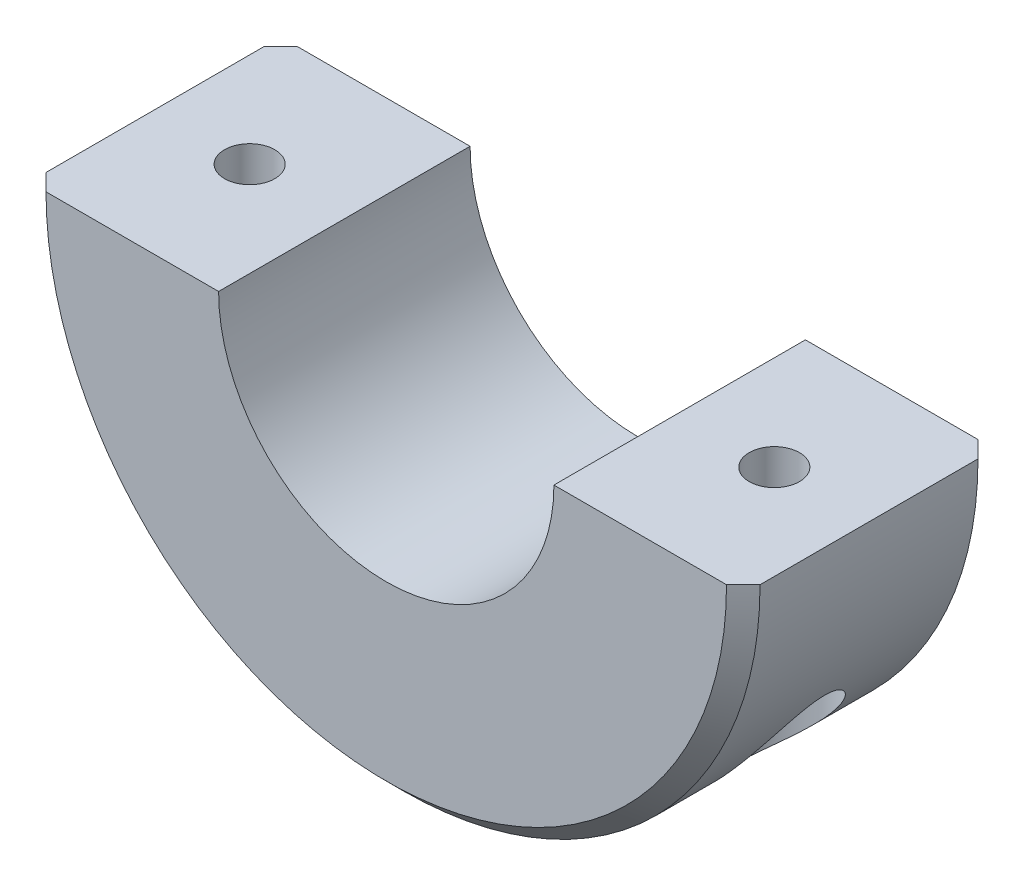
ISO-10303-21;
HEADER;
FILE_DESCRIPTION(('STEP AP214'),'2;1');
FILE_NAME('part.step','',(''),(''),'','','');
FILE_SCHEMA(('AUTOMOTIVE_DESIGN { 1 0 10303 214 1 1 1 1 }'));
ENDSEC;
DATA;
#1=APPLICATION_CONTEXT('core data for automotive mechanical design processes');
#2=APPLICATION_PROTOCOL_DEFINITION('international standard','automotive_design',2000,#1);
#3=PRODUCT_CONTEXT('',#1,'mechanical');
#4=PRODUCT('Part','Part','',(#3));
#5=PRODUCT_RELATED_PRODUCT_CATEGORY('part','',(#4));
#6=PRODUCT_DEFINITION_FORMATION('','',#4);
#7=PRODUCT_DEFINITION_CONTEXT('part definition',#1,'design');
#8=PRODUCT_DEFINITION('design','',#6,#7);
#9=PRODUCT_DEFINITION_SHAPE('','',#8);
#10=(LENGTH_UNIT() NAMED_UNIT(*) SI_UNIT(.MILLI.,.METRE.));
#11=(NAMED_UNIT(*) PLANE_ANGLE_UNIT() SI_UNIT($,.RADIAN.));
#12=(NAMED_UNIT(*) SI_UNIT($,.STERADIAN.) SOLID_ANGLE_UNIT());
#13=UNCERTAINTY_MEASURE_WITH_UNIT(LENGTH_MEASURE(1.E-05),#10,'distance_accuracy_value','');
#14=(GEOMETRIC_REPRESENTATION_CONTEXT(3) GLOBAL_UNCERTAINTY_ASSIGNED_CONTEXT((#13)) GLOBAL_UNIT_ASSIGNED_CONTEXT((#10,
#11,#12)) REPRESENTATION_CONTEXT('',''));
#15=CARTESIAN_POINT('',(0.,0.,0.));
#16=DIRECTION('',(0.,0.,1.));
#17=DIRECTION('',(1.,0.,0.));
#18=AXIS2_PLACEMENT_3D('',#15,#16,#17);
#19=CARTESIAN_POINT('',(0.,0.,15.));
#20=DIRECTION('',(0.,0.,-1.));
#21=DIRECTION('',(-1.,0.,0.));
#22=AXIS2_PLACEMENT_3D('',#19,#20,#21);
#23=CYLINDRICAL_SURFACE('',#22,21.295);
#24=CARTESIAN_POINT('',(-15.6475,-14.4441257523604,4.5));
#25=CARTESIAN_POINT('',(-15.4760530927391,-14.6298515063277,4.49999644710418));
#26=CARTESIAN_POINT('',(-15.3011361385541,-14.812675057769,4.51466141748248));
#27=CARTESIAN_POINT('',(-14.9476095886354,-15.1693442511802,4.5772634294069));
#28=CARTESIAN_POINT('',(-14.7689972772941,-15.3431829366967,4.6252258485544));
#29=CARTESIAN_POINT('',(-14.4377605628931,-15.6547927324771,4.74983645693914));
#30=CARTESIAN_POINT('',(-14.2849276280751,-15.7942426057744,4.82165551483415));
#31=CARTESIAN_POINT('',(-13.9855902691616,-16.0598924202691,4.99640390015968));
#32=CARTESIAN_POINT('',(-13.8390776446753,-16.1861098542607,5.09929143935881));
#33=CARTESIAN_POINT('',(-13.5867835567349,-16.3981110524623,5.3147459910154));
#34=CARTESIAN_POINT('',(-13.478638252255,-16.4869758862966,5.4214902335418));
#35=CARTESIAN_POINT('',(-13.2757717671095,-16.6507615836534,5.65638753760536));
#36=CARTESIAN_POINT('',(-13.1810370090129,-16.725696574797,5.78451865544885));
#37=CARTESIAN_POINT('',(-13.0231730692047,-16.8488133372999,6.03987984404355));
#38=CARTESIAN_POINT('',(-12.95743517646,-16.8993212601423,6.16436907206556));
#39=CARTESIAN_POINT('',(-12.8429176551253,-16.986514922178,6.42547480897054));
#40=CARTESIAN_POINT('',(-12.7941321897651,-17.0232054191166,6.56208712346158));
#41=CARTESIAN_POINT('',(-12.71627762263,-17.0814437005343,6.84464055110978));
#42=CARTESIAN_POINT('',(-12.6872969491071,-17.1029235849842,6.99062036114909));
#43=CARTESIAN_POINT('',(-12.6513801323208,-17.1295105053365,7.28673359588763));
#44=CARTESIAN_POINT('',(-12.6444374627388,-17.1346223884509,7.43686577761899));
#45=CARTESIAN_POINT('',(-12.65270719023,-17.128514907323,7.72398435694047));
#46=CARTESIAN_POINT('',(-12.6661762644164,-17.1185806429712,7.86105355647302));
#47=CARTESIAN_POINT('',(-12.7113076553484,-17.085094743882,8.13041174336142));
#48=CARTESIAN_POINT('',(-12.7429682832428,-17.0615443732234,8.26270117324571));
#49=CARTESIAN_POINT('',(-12.8228712837356,-17.0015727340766,8.51963468174272));
#50=CARTESIAN_POINT('',(-12.8711781533797,-16.9651013866669,8.64424676674093));
#51=CARTESIAN_POINT('',(-12.9819111548619,-16.8805168415109,8.88272929823964));
#52=CARTESIAN_POINT('',(-13.0443406620244,-16.8324008604934,8.99659716762731));
#53=CARTESIAN_POINT('',(-13.1872091958836,-16.7207503265065,9.2223503926327));
#54=CARTESIAN_POINT('',(-13.268804551489,-16.6561761865481,9.33298499575899));
#55=CARTESIAN_POINT('',(-13.4422520717717,-16.5165167116951,9.53837951374563));
#56=CARTESIAN_POINT('',(-13.5341108075533,-16.4414246348243,9.63312916011687));
#57=CARTESIAN_POINT('',(-13.7691962477943,-16.2455865541638,9.84681935760195));
#58=CARTESIAN_POINT('',(-13.9165193230396,-16.1197968881876,9.95665771367594));
#59=CARTESIAN_POINT('',(-14.218732686902,-15.8538750134691,10.1439298085008));
#60=CARTESIAN_POINT('',(-14.373637497486,-15.7137146687464,10.2212984077004));
#61=CARTESIAN_POINT('',(-14.63452938173,-15.4702405613806,10.3260776820154));
#62=CARTESIAN_POINT('',(-14.7400482821442,-15.3697609347497,10.3615525939811));
#63=CARTESIAN_POINT('',(-14.9507561498303,-15.1648789388324,10.4200178311233));
#64=CARTESIAN_POINT('',(-15.0559449946786,-15.0604752661818,10.4430039682891));
#65=CARTESIAN_POINT('',(-15.3697385587125,-14.742338347997,10.4946370095352));
#66=CARTESIAN_POINT('',(-15.5764850285907,-14.523758518302,10.5059264142721));
#67=CARTESIAN_POINT('',(-15.908782359279,-14.1571882389417,10.49147110175));
#68=CARTESIAN_POINT('',(-16.037425854755,-14.0112667387599,10.4773050935135));
#69=CARTESIAN_POINT('',(-16.2896152324844,-13.7172477269278,10.4332694294161));
#70=CARTESIAN_POINT('',(-16.4131591945293,-13.5691494235686,10.4033939153438));
#71=CARTESIAN_POINT('',(-16.6545256950066,-13.2717953472467,10.328759983751));
#72=CARTESIAN_POINT('',(-16.7723414869915,-13.1225384385884,10.2839844819571));
#73=CARTESIAN_POINT('',(-17.0015495043312,-12.824183653669,10.179997532712));
#74=CARTESIAN_POINT('',(-17.1129439635395,-12.6750857400302,10.1207911434124));
#75=CARTESIAN_POINT('',(-17.3024865443686,-12.414518193281,10.0040376860033));
#76=CARTESIAN_POINT('',(-17.3821236370956,-12.3027292292381,9.94959923146312));
#77=CARTESIAN_POINT('',(-17.537133063388,-12.0807408169721,9.83211211200685));
#78=CARTESIAN_POINT('',(-17.6125062479891,-11.9705410548541,9.76906517389888));
#79=CARTESIAN_POINT('',(-17.7584006324819,-11.7530136244082,9.6340000265735));
#80=CARTESIAN_POINT('',(-17.8289354044094,-11.6456784854901,9.56200865034514));
#81=CARTESIAN_POINT('',(-17.9647881477581,-11.4349942582723,9.40806520260075));
#82=CARTESIAN_POINT('',(-18.0301098243835,-11.3316423663905,9.32612031191883));
#83=CARTESIAN_POINT('',(-18.1523192913714,-11.1347757702379,9.15426080849563));
#84=CARTESIAN_POINT('',(-18.2094336338167,-11.0410362715813,9.06476896949109));
#85=CARTESIAN_POINT('',(-18.3167655365169,-10.8620428310368,8.87369240339546));
#86=CARTESIAN_POINT('',(-18.3669836496736,-10.7767882090293,8.77210864698827));
#87=CARTESIAN_POINT('',(-18.4501867402773,-10.6335904404364,8.57439301545309));
#88=CARTESIAN_POINT('',(-18.4846486786037,-10.5734842145515,8.48047984138216));
#89=CARTESIAN_POINT('',(-18.5453809122197,-10.4665967866234,8.28287941468207));
#90=CARTESIAN_POINT('',(-18.5716696932452,-10.4197855355773,8.17921491983239));
#91=CARTESIAN_POINT('',(-18.6081218495292,-10.3545089752696,7.99127415121887));
#92=CARTESIAN_POINT('',(-18.6206994140833,-10.3318402740876,7.90894658953466));
#93=CARTESIAN_POINT('',(-18.6389807638971,-10.2988245966545,7.74112296675136));
#94=CARTESIAN_POINT('',(-18.6446924700064,-10.2884634218959,7.65563067431754));
#95=CARTESIAN_POINT('',(-18.6486917006961,-10.2812132194571,7.48360790671748));
#96=CARTESIAN_POINT('',(-18.646955433139,-10.2843673656826,7.39707498637032));
#97=CARTESIAN_POINT('',(-18.6361912540249,-10.3038591991889,7.22596442550438));
#98=CARTESIAN_POINT('',(-18.6271572534581,-10.3202078955969,7.14138847846626));
#99=CARTESIAN_POINT('',(-18.5998569494841,-10.3693435503563,6.95774445951532));
#100=CARTESIAN_POINT('',(-18.579970347077,-10.4050021277343,6.85969903765366));
#101=CARTESIAN_POINT('',(-18.5324589484349,-10.4893916608364,6.67145223476729));
#102=CARTESIAN_POINT('',(-18.5048181279034,-10.538149677973,6.58126760958269));
#103=CARTESIAN_POINT('',(-18.4253532978838,-10.6767457589149,6.35770579720961));
#104=CARTESIAN_POINT('',(-18.3689177022653,-10.7737807131696,6.23049668569251));
#105=CARTESIAN_POINT('',(-18.2454309117825,-10.9816226682618,5.99379970067162));
#106=CARTESIAN_POINT('',(-18.1783502859404,-11.0924676624141,5.88436271202515));
#107=CARTESIAN_POINT('',(-18.0428761034018,-11.3113493927775,5.69037171764675));
#108=CARTESIAN_POINT('',(-17.9752222998206,-11.4186400337583,5.60443875804709));
#109=CARTESIAN_POINT('',(-17.8342372374115,-11.637610912113,5.44339030751038));
#110=CARTESIAN_POINT('',(-17.7609015780947,-11.7492945181248,5.36828333249387));
#111=CARTESIAN_POINT('',(-17.6091145151406,-11.9755882349553,5.22782704097956));
#112=CARTESIAN_POINT('',(-17.5306548787709,-12.0902028659402,5.16249401146454));
#113=CARTESIAN_POINT('',(-17.3691800946446,-12.3210572167888,5.04113602599785));
#114=CARTESIAN_POINT('',(-17.2861662531701,-12.4372964636089,4.98510841935093));
#115=CARTESIAN_POINT('',(-17.1091904893484,-12.6797826426273,4.87798112417469));
#116=CARTESIAN_POINT('',(-17.0148806731231,-12.8060989681295,4.82761339128085));
#117=CARTESIAN_POINT('',(-16.821614659748,-13.0589292280997,4.73724158091151));
#118=CARTESIAN_POINT('',(-16.7226574216625,-13.1854432006434,4.69723983842743));
#119=CARTESIAN_POINT('',(-16.5207455605889,-13.4375592292108,4.62792748340577));
#120=CARTESIAN_POINT('',(-16.4178038356276,-13.5631628828648,4.59858512276646));
#121=CARTESIAN_POINT('',(-16.2080165369454,-13.8131762628668,4.55086642958649));
#122=CARTESIAN_POINT('',(-16.1011717873131,-13.9375862343255,4.53248779619373));
#123=CARTESIAN_POINT('',(-15.9359912963323,-14.1254580888567,4.51335977423382));
#124=CARTESIAN_POINT('',(-15.878901179535,-14.1896051810079,4.50838281025922));
#125=CARTESIAN_POINT('',(-15.7638417214915,-14.3173224281142,4.50170275995473));
#126=CARTESIAN_POINT('',(-15.7058719805789,-14.3808922984778,4.50000120964309));
#127=CARTESIAN_POINT('',(-15.6475,-14.4441257523604,4.5));
#128=B_SPLINE_CURVE_WITH_KNOTS('',3,(#24,#25,#26,#27,#28,#29,#30,#31,#32,#33,#34,#35,#36,#37,
#38,#39,#40,#41,#42,#43,#44,#45,#46,#47,#48,#49,#50,#51,#52,#53,#54,#55,#56,#57,#58,#59,#60,#61,
#62,#63,#64,#65,#66,#67,#68,#69,#70,#71,#72,#73,#74,#75,#76,#77,#78,#79,#80,#81,#82,#83,#84,#85,
#86,#87,#88,#89,#90,#91,#92,#93,#94,#95,#96,#97,#98,#99,#100,#101,#102,#103,#104,#105,#106,#107,
#108,#109,#110,#111,#112,#113,#114,#115,#116,#117,#118,#119,#120,#121,#122,#123,#124,#125,#126,
#127),.UNSPECIFIED.,.T.,.F.,(4,2,2,2,2,2,2,2,2,2,2,2,2,2,2,2,2,2,2,2,2,2,2,2,2,2,2,2,2,2,2,2,2,
2,2,2,2,2,2,2,2,2,2,2,2,2,2,2,2,2,2,4),(0.,0.758096662073505,1.51677174160776,2.1715269420264,
2.82540536635916,3.35147616857002,3.87701048458265,4.32381201946686,4.77045956649558,
5.21908858519798,5.6675847348241,6.07987395991628,6.49212491545079,6.90599146859646,
7.31995704096121,7.77385428596017,8.22804382110952,8.89246018055481,9.55820316693697,
10.007520324473,10.4569880640758,11.3562816155653,11.9408311168917,12.5255987565596,
13.1110392123537,13.6962747605206,14.1389585492756,14.581553668522,15.0228517038903,
15.4638332406225,15.888007942467,16.3121486164385,16.6612001756589,17.0094564214015,
17.2673486477389,17.5249430683381,17.7833609717204,18.0419947142443,18.3588399289208,
18.6763447979507,19.182467790771,19.6900152875453,20.1489995132213,20.6083428368076,
21.0684432673756,21.5284124104613,22.0244843700694,22.5206679754377,23.0153613812225,
23.5099509339006,23.7679367275779,24.026043475273),.UNSPECIFIED.);
#129=CARTESIAN_POINT('',(-15.6475,-14.4441257523604,4.5));
#130=VERTEX_POINT('',#129);
#131=EDGE_CURVE('E126',#130,#130,#128,.T.);
#132=ORIENTED_EDGE('',*,*,#131,.F.);
#133=EDGE_LOOP('',(#132));
#134=FACE_BOUND('',#133,.T.);
#135=DIRECTION('',(0.,0.,-1.));
#136=VECTOR('',#135,1.);
#137=CARTESIAN_POINT('',(21.295,0.,15.));
#138=LINE('',#137,#136);
#139=CARTESIAN_POINT('',(21.295,0.,14.));
#140=VERTEX_POINT('',#139);
#141=CARTESIAN_POINT('',(21.295,0.,1.00000000000001));
#142=VERTEX_POINT('',#141);
#143=EDGE_CURVE('E119',#140,#142,#138,.T.);
#144=ORIENTED_EDGE('',*,*,#143,.F.);
#145=CARTESIAN_POINT('',(0.,0.,14.));
#146=DIRECTION('',(0.,0.,1.));
#147=DIRECTION('',(1.,0.,0.));
#148=AXIS2_PLACEMENT_3D('',#145,#146,#147);
#149=CIRCLE('',#148,21.295);
#150=CARTESIAN_POINT('',(-21.295,0.,14.));
#151=VERTEX_POINT('',#150);
#152=EDGE_CURVE('E229',#140,#151,#149,.F.);
#153=ORIENTED_EDGE('',*,*,#152,.T.);
#154=DIRECTION('',(0.,0.,-1.));
#155=VECTOR('',#154,1.);
#156=CARTESIAN_POINT('',(-21.295,0.,15.));
#157=LINE('',#156,#155);
#158=CARTESIAN_POINT('',(-21.295,0.,1.00000000000001));
#159=VERTEX_POINT('',#158);
#160=EDGE_CURVE('E115',#151,#159,#157,.T.);
#161=ORIENTED_EDGE('',*,*,#160,.T.);
#162=CARTESIAN_POINT('',(0.,0.,1.00000000000001));
#163=DIRECTION('',(0.,0.,1.));
#164=DIRECTION('',(1.,0.,0.));
#165=AXIS2_PLACEMENT_3D('',#162,#163,#164);
#166=CIRCLE('',#165,21.295);
#167=EDGE_CURVE('E227',#159,#142,#166,.T.);
#168=ORIENTED_EDGE('',*,*,#167,.T.);
#169=EDGE_LOOP('',(#144,#153,#161,#168));
#170=FACE_BOUND('',#169,.T.);
#171=CARTESIAN_POINT('',(15.6475,-14.4441257523604,4.5));
#172=CARTESIAN_POINT('',(15.7762606198741,-14.3046397694082,4.50000077555573));
#173=CARTESIAN_POINT('',(15.9031195321839,-14.1634599121603,4.50827490788279));
#174=CARTESIAN_POINT('',(16.1522460392305,-13.878680485501,4.54009975071234));
#175=CARTESIAN_POINT('',(16.2745112534873,-13.7350797159076,4.5636582692381));
#176=CARTESIAN_POINT('',(16.514085303948,-13.4460909028869,4.62521709867059));
#177=CARTESIAN_POINT('',(16.6313774301595,-13.3006986723353,4.6632623783617));
#178=CARTESIAN_POINT('',(16.8600436394976,-13.0096189758028,4.7532141385738));
#179=CARTESIAN_POINT('',(16.9714195231929,-12.8639316138193,4.80511637250807));
#180=CARTESIAN_POINT('',(17.1712307864709,-12.5956106654095,4.91366752224205));
#181=CARTESIAN_POINT('',(17.2605688305499,-12.4728603135809,4.96837515230786));
#182=CARTESIAN_POINT('',(17.4343646727043,-12.2287527754492,5.08789627741931));
#183=CARTESIAN_POINT('',(17.5188212631242,-12.1073959397976,5.15271225869417));
#184=CARTESIAN_POINT('',(17.682032723982,-11.867757427708,5.2926961239707));
#185=CARTESIAN_POINT('',(17.7608107656725,-11.7494646841628,5.36781782344624));
#186=CARTESIAN_POINT('',(17.9123805202063,-11.5170675789358,5.52956824711495));
#187=CARTESIAN_POINT('',(17.9851772087075,-11.4029597806218,5.61618724698152));
#188=CARTESIAN_POINT('',(18.11501156981,-11.195375115743,5.79071133748997));
#189=CARTESIAN_POINT('',(18.1728771601661,-11.101116539212,5.87706167999959));
#190=CARTESIAN_POINT('',(18.2822955543656,-10.9199752181981,6.06146520210517));
#191=CARTESIAN_POINT('',(18.3338358412268,-10.8331071996275,6.15954085131257));
#192=CARTESIAN_POINT('',(18.405157081629,-10.7111860891224,6.31733060062894));
#193=CARTESIAN_POINT('',(18.4280848586271,-10.6716725044501,6.372169655445));
#194=CARTESIAN_POINT('',(18.4713793890059,-10.5965582221619,6.48540636519385));
#195=CARTESIAN_POINT('',(18.4917455610353,-10.5609584130002,6.54380482347826));
#196=CARTESIAN_POINT('',(18.548136968196,-10.4618053665572,6.72410448162929));
#197=CARTESIAN_POINT('',(18.5797603447616,-10.4053720884239,6.85175650074522));
#198=CARTESIAN_POINT('',(18.6169525273258,-10.338614548178,7.0653151585471));
#199=CARTESIAN_POINT('',(18.6278848311012,-10.3188742763932,7.14737198288479));
#200=CARTESIAN_POINT('',(18.6429010097187,-10.2917206397089,7.31412672597987));
#201=CARTESIAN_POINT('',(18.6469915463876,-10.2842952838385,7.39882199371593));
#202=CARTESIAN_POINT('',(18.6479196836257,-10.2826125137718,7.56853965849787));
#203=CARTESIAN_POINT('',(18.6447439092984,-10.2883793821316,7.65356237075026));
#204=CARTESIAN_POINT('',(18.6314384726888,-10.3124537807099,7.82126112170951));
#205=CARTESIAN_POINT('',(18.6213023876847,-10.3307728936497,7.90393491948498));
#206=CARTESIAN_POINT('',(18.5912167245019,-10.384838937983,8.08777955625475));
#207=CARTESIAN_POINT('',(18.5693064894438,-10.4240425165247,8.18759671722758));
#208=CARTESIAN_POINT('',(18.5176171555785,-10.5155896307239,8.37880704164027));
#209=CARTESIAN_POINT('',(18.4878206585698,-10.5679622061165,8.47018096929802));
#210=CARTESIAN_POINT('',(18.4283748665657,-10.6712175514293,8.62802543713749));
#211=CARTESIAN_POINT('',(18.3997537447936,-10.720524870567,8.69594596462234));
#212=CARTESIAN_POINT('',(18.3392039511317,-10.8237803500828,8.82661713711708));
#213=CARTESIAN_POINT('',(18.3072731265405,-10.8777315270078,8.88936436907006));
#214=CARTESIAN_POINT('',(18.2071993900904,-11.0449855578991,9.07069518103934));
#215=CARTESIAN_POINT('',(18.1348644514973,-11.1635322418614,9.18214324617132));
#216=CARTESIAN_POINT('',(17.9893491054634,-11.396376319151,9.37859659525922));
#217=CARTESIAN_POINT('',(17.9169666406441,-11.5099258131168,9.46512892124745));
#218=CARTESIAN_POINT('',(17.7662327173166,-11.7412544486542,9.62677850576808));
#219=CARTESIAN_POINT('',(17.6878767654041,-11.8590367383251,9.70188704127808));
#220=CARTESIAN_POINT('',(17.5258088573363,-12.097266084364,9.84166916421463));
#221=CARTESIAN_POINT('',(17.4420910881718,-12.2177159369833,9.90633114915559));
#222=CARTESIAN_POINT('',(17.2698260213067,-12.4600252599897,10.025674271603));
#223=CARTESIAN_POINT('',(17.1812799756034,-12.5818843585552,10.0803579806933));
#224=CARTESIAN_POINT('',(16.9933400883096,-12.8347156445581,10.1834657508801));
#225=CARTESIAN_POINT('',(16.8936202294927,-12.9657314896476,10.2311886991638));
#226=CARTESIAN_POINT('',(16.6893523602816,-13.227627440357,10.3154482484809));
#227=CARTESIAN_POINT('',(16.5848036787537,-13.3585075245081,10.3519832891467));
#228=CARTESIAN_POINT('',(16.3713525909082,-13.6192585794276,10.4134793863802));
#229=CARTESIAN_POINT('',(16.2624538264595,-13.7491302899314,10.4384499129059));
#230=CARTESIAN_POINT('',(16.0406831565721,-14.0072282799434,10.4762487121058));
#231=CARTESIAN_POINT('',(15.9278119327807,-14.1354548366457,10.4890790575186));
#232=CARTESIAN_POINT('',(15.7142298225266,-14.3722604382679,10.5008963456839));
#233=CARTESIAN_POINT('',(15.6139475619258,-14.4811441633425,10.5015257520346));
#234=CARTESIAN_POINT('',(15.4113139870092,-14.6966084200798,10.4924079453917));
#235=CARTESIAN_POINT('',(15.3089621174534,-14.8031883173627,10.4826579105456));
#236=CARTESIAN_POINT('',(15.1029802776851,-15.0132812894383,10.4520037718319));
#237=CARTESIAN_POINT('',(14.999351829083,-15.116797593417,10.4311118886564));
#238=CARTESIAN_POINT('',(14.7915999207006,-15.3201420333013,10.3773163722297));
#239=CARTESIAN_POINT('',(14.6874764749187,-15.4199702728123,10.3444130766873));
#240=CARTESIAN_POINT('',(14.429182913385,-15.6627090810949,10.2464513607865));
#241=CARTESIAN_POINT('',(14.2753336638861,-15.8029259076231,10.1735370389933));
#242=CARTESIAN_POINT('',(13.9742389213128,-16.0697857598965,9.99612176331441));
#243=CARTESIAN_POINT('',(13.8269839889193,-16.1964485736233,9.89166773158459));
#244=CARTESIAN_POINT('',(13.5750979357564,-16.4077744200926,9.67414257082861));
#245=CARTESIAN_POINT('',(13.467918592077,-16.4957236924005,9.56723130618892));
#246=CARTESIAN_POINT('',(13.2668904071248,-16.6578294775708,9.33208377119938));
#247=CARTESIAN_POINT('',(13.1730389144668,-16.73198873467,9.2038517533576));
#248=CARTESIAN_POINT('',(13.0460288206915,-16.8309569402054,8.99634375000107));
#249=CARTESIAN_POINT('',(13.0058176522032,-16.8620275635493,8.92424114581989));
#250=CARTESIAN_POINT('',(12.9308842395464,-16.9195590627762,8.77550724928434));
#251=CARTESIAN_POINT('',(12.8961589815942,-16.9460224705372,8.69887847547734));
#252=CARTESIAN_POINT('',(12.8328756758649,-16.9939963212528,8.54166382732384));
#253=CARTESIAN_POINT('',(12.8043144404257,-17.0155093246423,8.46108002487369));
#254=CARTESIAN_POINT('',(12.7539371434656,-17.0533015730373,8.29667923196513));
#255=CARTESIAN_POINT('',(12.7321197222737,-17.0695818730737,8.21286289707979));
#256=CARTESIAN_POINT('',(12.6830246295393,-17.106123625679,7.98334691906928));
#257=CARTESIAN_POINT('',(12.6625528591522,-17.1212413789214,7.83526109047065));
#258=CARTESIAN_POINT('',(12.6440100054358,-17.1349401942358,7.53705686368497));
#259=CARTESIAN_POINT('',(12.6459262166495,-17.1335306357602,7.38693966663969));
#260=CARTESIAN_POINT('',(12.6708172365865,-17.1151278626507,7.10256030773085));
#261=CARTESIAN_POINT('',(12.6919662463822,-17.0994857020694,6.96804515335038));
#262=CARTESIAN_POINT('',(12.7515626745018,-17.0550884588756,6.70519706530106));
#263=CARTESIAN_POINT('',(12.790009590029,-17.0263337574038,6.57686395205937));
#264=CARTESIAN_POINT('',(12.8832889393301,-16.9558651607989,6.32635681481858));
#265=CARTESIAN_POINT('',(12.9384953724816,-16.9138545043217,6.20440698576438));
#266=CARTESIAN_POINT('',(13.0622367174416,-16.8184746593635,5.97234536124105));
#267=CARTESIAN_POINT('',(13.1307754500204,-16.7651022144066,5.86223697337203));
#268=CARTESIAN_POINT('',(13.2867643773373,-16.6418101572294,5.64339753471196));
#269=CARTESIAN_POINT('',(13.3754784339394,-16.570699543677,5.53624396777801));
#270=CARTESIAN_POINT('',(13.562304496502,-16.4181463118633,5.33887306819094));
#271=CARTESIAN_POINT('',(13.6604236240707,-16.3366958487896,5.24866872510176));
#272=CARTESIAN_POINT('',(13.9130409010001,-16.1227602961109,5.04449479077084));
#273=CARTESIAN_POINT('',(14.0714153456092,-15.9849629727471,4.94084712489513));
#274=CARTESIAN_POINT('',(14.3939396446127,-15.6951832705535,4.7683013838627));
#275=CARTESIAN_POINT('',(14.5580987617526,-15.5431774312905,4.69946202776865));
#276=CARTESIAN_POINT('',(14.878468563266,-15.2366328519882,4.59560146997709));
#277=CARTESIAN_POINT('',(15.0346760864102,-15.0825799461699,4.55909351117056));
#278=CARTESIAN_POINT('',(15.3439540059404,-14.7678293257901,4.51129721055664));
#279=CARTESIAN_POINT('',(15.497025595462,-14.6071342113647,4.499999093657));
#280=CARTESIAN_POINT('',(15.6475,-14.4441257523604,4.5));
#281=B_SPLINE_CURVE_WITH_KNOTS('',3,(#171,#172,#173,#174,#175,#176,#177,#178,#179,#180,#181,
#182,#183,#184,#185,#186,#187,#188,#189,#190,#191,#192,#193,#194,#195,#196,#197,#198,#199,#200,
#201,#202,#203,#204,#205,#206,#207,#208,#209,#210,#211,#212,#213,#214,#215,#216,#217,#218,#219,
#220,#221,#222,#223,#224,#225,#226,#227,#228,#229,#230,#231,#232,#233,#234,#235,#236,#237,#238,
#239,#240,#241,#242,#243,#244,#245,#246,#247,#248,#249,#250,#251,#252,#253,#254,#255,#256,#257,
#258,#259,#260,#261,#262,#263,#264,#265,#266,#267,#268,#269,#270,#271,#272,#273,#274,#275,#276,
#277,#278,#279,#280),.UNSPECIFIED.,.T.,.F.,(4,2,2,2,2,2,2,2,2,2,2,2,2,2,2,2,2,2,2,2,2,2,2,2,2,2,
2,2,2,2,2,2,2,2,2,2,2,2,2,2,2,2,2,2,2,2,2,2,2,2,2,2,2,2,4),(0.,0.569249321501602,
1.13878967303682,1.7101125573636,2.28126055529446,2.765021137193,3.2489008920462,
3.73067899414659,4.21205217817969,4.63240813912198,5.05358295934892,5.26747934617411,
5.48142418912959,5.90668296116673,6.16097108262646,6.41501145936315,6.66951981724296,
6.9242633423374,7.25080189164392,7.57806692405813,7.84372567747759,8.10955831837802,
8.64207837195292,9.12169364694774,9.60167332944892,10.0821824911245,10.5625676413786,
11.0764064577399,11.5903169061379,12.1038057758122,12.6172069597805,13.0609307768062,
13.5047752595727,13.9481339194559,14.3914801149798,15.0507250414931,15.7089939905626,
16.2322707384477,16.7554432416545,17.0197354872183,17.2838820303416,17.5478916436723,
17.8118479932758,18.2599151016332,18.7077279387137,19.117016576485,19.5262933182672,
19.9454741595393,20.3647753071055,20.8317102409842,21.2990015782631,21.9974837539207,
22.6971403192568,23.3626441435643,24.0278898745209),.UNSPECIFIED.);
#282=CARTESIAN_POINT('',(15.6475,-14.4441257523604,4.5));
#283=VERTEX_POINT('',#282);
#284=EDGE_CURVE('E185',#283,#283,#281,.T.);
#285=ORIENTED_EDGE('',*,*,#284,.F.);
#286=EDGE_LOOP('',(#285));
#287=FACE_BOUND('',#286,.T.);
#288=ADVANCED_FACE('F38',(#134,#170,#287),#23,.T.);
#289=CARTESIAN_POINT('',(0.,0.,15.));
#290=DIRECTION('',(0.,0.,-1.));
#291=DIRECTION('',(-1.,0.,0.));
#292=AXIS2_PLACEMENT_3D('',#289,#290,#291);
#293=CYLINDRICAL_SURFACE('',#292,10.);
#294=CARTESIAN_POINT('',(0.,0.,0.));
#295=DIRECTION('',(0.,0.,-1.));
#296=DIRECTION('',(1.,0.,0.));
#297=AXIS2_PLACEMENT_3D('',#294,#295,#296);
#298=CIRCLE('',#297,10.);
#299=CARTESIAN_POINT('',(10.,0.,0.));
#300=VERTEX_POINT('',#299);
#301=CARTESIAN_POINT('',(-10.,0.,0.));
#302=VERTEX_POINT('',#301);
#303=EDGE_CURVE('E113',#300,#302,#298,.T.);
#304=ORIENTED_EDGE('',*,*,#303,.T.);
#305=DIRECTION('',(0.,0.,-1.));
#306=VECTOR('',#305,1.);
#307=CARTESIAN_POINT('',(-10.,0.,15.));
#308=LINE('',#307,#306);
#309=CARTESIAN_POINT('',(-10.,0.,15.));
#310=VERTEX_POINT('',#309);
#311=EDGE_CURVE('E94',#310,#302,#308,.T.);
#312=ORIENTED_EDGE('',*,*,#311,.F.);
#313=CARTESIAN_POINT('',(0.,0.,15.));
#314=DIRECTION('',(0.,0.,-1.));
#315=DIRECTION('',(1.,0.,0.));
#316=AXIS2_PLACEMENT_3D('',#313,#314,#315);
#317=CIRCLE('',#316,10.);
#318=CARTESIAN_POINT('',(10.,0.,15.));
#319=VERTEX_POINT('',#318);
#320=EDGE_CURVE('E101',#319,#310,#317,.T.);
#321=ORIENTED_EDGE('',*,*,#320,.F.);
#322=DIRECTION('',(0.,0.,-1.));
#323=VECTOR('',#322,1.);
#324=CARTESIAN_POINT('',(10.,0.,15.));
#325=LINE('',#324,#323);
#326=EDGE_CURVE('E221',#319,#300,#325,.T.);
#327=ORIENTED_EDGE('',*,*,#326,.T.);
#328=EDGE_LOOP('',(#304,#312,#321,#327));
#329=FACE_BOUND('',#328,.T.);
#330=ADVANCED_FACE('F111',(#329),#293,.F.);
#331=CARTESIAN_POINT('',(-21.295,0.,15.));
#332=DIRECTION('',(0.,-1.,0.));
#333=DIRECTION('',(0.,0.,-1.));
#334=AXIS2_PLACEMENT_3D('',#331,#332,#333);
#335=PLANE('',#334);
#336=CARTESIAN_POINT('',(-15.6475,0.,7.5));
#337=DIRECTION('',(0.,1.,0.));
#338=DIRECTION('',(0.,0.,1.));
#339=AXIS2_PLACEMENT_3D('',#336,#337,#338);
#340=CIRCLE('',#339,1.5);
#341=CARTESIAN_POINT('',(-15.6475,0.,9.));
#342=VERTEX_POINT('',#341);
#343=EDGE_CURVE('E214',#342,#342,#340,.T.);
#344=ORIENTED_EDGE('',*,*,#343,.F.);
#345=EDGE_LOOP('',(#344));
#346=FACE_BOUND('',#345,.T.);
#347=ORIENTED_EDGE('',*,*,#160,.F.);
#348=DIRECTION('',(-0.707106781186546,0.,-0.707106781186549));
#349=VECTOR('',#348,1.);
#350=CARTESIAN_POINT('',(0.,0.,35.2950000000001));
#351=LINE('',#350,#349);
#352=CARTESIAN_POINT('',(-20.295,0.,15.));
#353=VERTEX_POINT('',#352);
#354=EDGE_CURVE('E46',#151,#353,#351,.F.);
#355=ORIENTED_EDGE('',*,*,#354,.T.);
#356=DIRECTION('',(-1.,0.,0.));
#357=VECTOR('',#356,1.);
#358=CARTESIAN_POINT('',(-21.295,0.,15.));
#359=LINE('',#358,#357);
#360=EDGE_CURVE('E90',#310,#353,#359,.T.);
#361=ORIENTED_EDGE('',*,*,#360,.F.);
#362=ORIENTED_EDGE('',*,*,#311,.T.);
#363=DIRECTION('',(-1.,0.,0.));
#364=VECTOR('',#363,1.);
#365=CARTESIAN_POINT('',(-21.295,0.,0.));
#366=LINE('',#365,#364);
#367=CARTESIAN_POINT('',(-20.295,0.,0.));
#368=VERTEX_POINT('',#367);
#369=EDGE_CURVE('E223',#302,#368,#366,.T.);
#370=ORIENTED_EDGE('',*,*,#369,.T.);
#371=DIRECTION('',(0.707106781186546,0.,-0.707106781186549));
#372=VECTOR('',#371,1.);
#373=CARTESIAN_POINT('',(0.,0.,-20.2950000000001));
#374=LINE('',#373,#372);
#375=EDGE_CURVE('E58',#368,#159,#374,.F.);
#376=ORIENTED_EDGE('',*,*,#375,.T.);
#377=EDGE_LOOP('',(#347,#355,#361,#362,#370,#376));
#378=FACE_BOUND('',#377,.T.);
#379=ADVANCED_FACE('F92',(#346,#378),#335,.F.);
#380=CARTESIAN_POINT('',(10.,0.,15.));
#381=DIRECTION('',(0.,-1.,0.));
#382=DIRECTION('',(0.,0.,-1.));
#383=AXIS2_PLACEMENT_3D('',#380,#381,#382);
#384=PLANE('',#383);
#385=CARTESIAN_POINT('',(15.6475,0.,7.5));
#386=DIRECTION('',(0.,1.,0.));
#387=DIRECTION('',(0.,0.,1.));
#388=AXIS2_PLACEMENT_3D('',#385,#386,#387);
#389=CIRCLE('',#388,1.5);
#390=CARTESIAN_POINT('',(15.6475,0.,9.));
#391=VERTEX_POINT('',#390);
#392=EDGE_CURVE('E135',#391,#391,#389,.T.);
#393=ORIENTED_EDGE('',*,*,#392,.F.);
#394=EDGE_LOOP('',(#393));
#395=FACE_BOUND('',#394,.T.);
#396=DIRECTION('',(-1.,0.,0.));
#397=VECTOR('',#396,1.);
#398=CARTESIAN_POINT('',(10.,0.,15.));
#399=LINE('',#398,#397);
#400=CARTESIAN_POINT('',(20.295,0.,15.));
#401=VERTEX_POINT('',#400);
#402=EDGE_CURVE('E100',#401,#319,#399,.T.);
#403=ORIENTED_EDGE('',*,*,#402,.F.);
#404=DIRECTION('',(-0.707106781186546,0.,0.707106781186549));
#405=VECTOR('',#404,1.);
#406=CARTESIAN_POINT('',(0.,0.,35.2950000000001));
#407=LINE('',#406,#405);
#408=EDGE_CURVE('E226',#401,#140,#407,.F.);
#409=ORIENTED_EDGE('',*,*,#408,.T.);
#410=ORIENTED_EDGE('',*,*,#143,.T.);
#411=DIRECTION('',(0.707106781186546,0.,0.707106781186549));
#412=VECTOR('',#411,1.);
#413=CARTESIAN_POINT('',(0.,0.,-20.2950000000001));
#414=LINE('',#413,#412);
#415=CARTESIAN_POINT('',(20.295,0.,0.));
#416=VERTEX_POINT('',#415);
#417=EDGE_CURVE('E117',#142,#416,#414,.F.);
#418=ORIENTED_EDGE('',*,*,#417,.T.);
#419=DIRECTION('',(-1.,0.,0.));
#420=VECTOR('',#419,1.);
#421=CARTESIAN_POINT('',(10.,0.,0.));
#422=LINE('',#421,#420);
#423=EDGE_CURVE('E109',#416,#300,#422,.T.);
#424=ORIENTED_EDGE('',*,*,#423,.T.);
#425=ORIENTED_EDGE('',*,*,#326,.F.);
#426=EDGE_LOOP('',(#403,#409,#410,#418,#424,#425));
#427=FACE_BOUND('',#426,.T.);
#428=ADVANCED_FACE('F160',(#395,#427),#384,.F.);
#429=CARTESIAN_POINT('',(0.,0.,15.));
#430=DIRECTION('',(0.,0.,1.));
#431=DIRECTION('',(1.,0.,0.));
#432=AXIS2_PLACEMENT_3D('',#429,#430,#431);
#433=PLANE('',#432);
#434=ORIENTED_EDGE('',*,*,#360,.T.);
#435=CARTESIAN_POINT('',(0.,0.,15.));
#436=DIRECTION('',(0.,0.,1.));
#437=DIRECTION('',(1.,0.,0.));
#438=AXIS2_PLACEMENT_3D('',#435,#436,#437);
#439=CIRCLE('',#438,20.295);
#440=EDGE_CURVE('E114',#353,#401,#439,.T.);
#441=ORIENTED_EDGE('',*,*,#440,.T.);
#442=ORIENTED_EDGE('',*,*,#402,.T.);
#443=ORIENTED_EDGE('',*,*,#320,.T.);
#444=EDGE_LOOP('',(#434,#441,#442,#443));
#445=FACE_BOUND('',#444,.T.);
#446=ADVANCED_FACE('F104',(#445),#433,.T.);
#447=CARTESIAN_POINT('',(0.,0.,0.));
#448=DIRECTION('',(0.,0.,1.));
#449=DIRECTION('',(1.,0.,0.));
#450=AXIS2_PLACEMENT_3D('',#447,#448,#449);
#451=PLANE('',#450);
#452=ORIENTED_EDGE('',*,*,#423,.F.);
#453=CARTESIAN_POINT('',(0.,0.,0.));
#454=DIRECTION('',(0.,0.,1.));
#455=DIRECTION('',(1.,0.,0.));
#456=AXIS2_PLACEMENT_3D('',#453,#454,#455);
#457=CIRCLE('',#456,20.295);
#458=EDGE_CURVE('E11',#416,#368,#457,.F.);
#459=ORIENTED_EDGE('',*,*,#458,.T.);
#460=ORIENTED_EDGE('',*,*,#369,.F.);
#461=ORIENTED_EDGE('',*,*,#303,.F.);
#462=EDGE_LOOP('',(#452,#459,#460,#461));
#463=FACE_BOUND('',#462,.T.);
#464=ADVANCED_FACE('F156',(#463),#451,.F.);
#465=CARTESIAN_POINT('',(-15.6475,-34.,7.5));
#466=DIRECTION('',(0.,1.,0.));
#467=DIRECTION('',(0.,0.,1.));
#468=AXIS2_PLACEMENT_3D('',#465,#466,#467);
#469=CYLINDRICAL_SURFACE('',#468,1.5);
#470=CARTESIAN_POINT('',(-15.6475,-7.,7.5));
#471=DIRECTION('',(0.,1.,0.));
#472=DIRECTION('',(0.,0.,1.));
#473=AXIS2_PLACEMENT_3D('',#470,#471,#472);
#474=CIRCLE('',#473,1.5);
#475=CARTESIAN_POINT('',(-15.6475,-7.,9.));
#476=VERTEX_POINT('',#475);
#477=EDGE_CURVE('E123',#476,#476,#474,.F.);
#478=ORIENTED_EDGE('',*,*,#477,.T.);
#479=EDGE_LOOP('',(#478));
#480=FACE_BOUND('',#479,.T.);
#481=ORIENTED_EDGE('',*,*,#343,.T.);
#482=EDGE_LOOP('',(#481));
#483=FACE_BOUND('',#482,.T.);
#484=ADVANCED_FACE('F152',(#480,#483),#469,.F.);
#485=CARTESIAN_POINT('',(15.6475,-34.,7.5));
#486=DIRECTION('',(0.,1.,0.));
#487=DIRECTION('',(0.,0.,1.));
#488=AXIS2_PLACEMENT_3D('',#485,#486,#487);
#489=CYLINDRICAL_SURFACE('',#488,1.5);
#490=CARTESIAN_POINT('',(15.6475,-7.,7.5));
#491=DIRECTION('',(0.,1.,0.));
#492=DIRECTION('',(0.,0.,1.));
#493=AXIS2_PLACEMENT_3D('',#490,#491,#492);
#494=CIRCLE('',#493,1.5);
#495=CARTESIAN_POINT('',(15.6475,-7.,9.));
#496=VERTEX_POINT('',#495);
#497=EDGE_CURVE('E136',#496,#496,#494,.F.);
#498=ORIENTED_EDGE('',*,*,#497,.T.);
#499=EDGE_LOOP('',(#498));
#500=FACE_BOUND('',#499,.T.);
#501=ORIENTED_EDGE('',*,*,#392,.T.);
#502=EDGE_LOOP('',(#501));
#503=FACE_BOUND('',#502,.T.);
#504=ADVANCED_FACE('F147',(#500,#503),#489,.F.);
#505=CARTESIAN_POINT('',(-15.6475,-7.,7.5));
#506=DIRECTION('',(0.,-1.,0.));
#507=DIRECTION('',(0.,0.,-1.));
#508=AXIS2_PLACEMENT_3D('',#505,#506,#507);
#509=CYLINDRICAL_SURFACE('',#508,3.);
#510=CARTESIAN_POINT('',(-15.6475,-7.,7.5));
#511=DIRECTION('',(0.,1.,0.));
#512=DIRECTION('',(0.,0.,1.));
#513=AXIS2_PLACEMENT_3D('',#510,#511,#512);
#514=CIRCLE('',#513,3.);
#515=CARTESIAN_POINT('',(-15.6475,-7.,10.5));
#516=VERTEX_POINT('',#515);
#517=EDGE_CURVE('E127',#516,#516,#514,.T.);
#518=ORIENTED_EDGE('',*,*,#517,.T.);
#519=EDGE_LOOP('',(#518));
#520=FACE_BOUND('',#519,.T.);
#521=ORIENTED_EDGE('',*,*,#131,.T.);
#522=EDGE_LOOP('',(#521));
#523=FACE_BOUND('',#522,.T.);
#524=ADVANCED_FACE('F141',(#520,#523),#509,.F.);
#525=CARTESIAN_POINT('',(-15.6475,-7.,7.5));
#526=DIRECTION('',(0.,1.,0.));
#527=DIRECTION('',(0.,0.,1.));
#528=AXIS2_PLACEMENT_3D('',#525,#526,#527);
#529=PLANE('',#528);
#530=ORIENTED_EDGE('',*,*,#517,.F.);
#531=EDGE_LOOP('',(#530));
#532=FACE_BOUND('',#531,.T.);
#533=ORIENTED_EDGE('',*,*,#477,.F.);
#534=EDGE_LOOP('',(#533));
#535=FACE_BOUND('',#534,.T.);
#536=ADVANCED_FACE('F146',(#532,#535),#529,.F.);
#537=CARTESIAN_POINT('',(15.6475,-7.,7.5));
#538=DIRECTION('',(0.,-1.,0.));
#539=DIRECTION('',(0.,0.,-1.));
#540=AXIS2_PLACEMENT_3D('',#537,#538,#539);
#541=CYLINDRICAL_SURFACE('',#540,3.);
#542=CARTESIAN_POINT('',(15.6475,-7.,7.5));
#543=DIRECTION('',(0.,1.,0.));
#544=DIRECTION('',(0.,0.,1.));
#545=AXIS2_PLACEMENT_3D('',#542,#543,#544);
#546=CIRCLE('',#545,3.);
#547=CARTESIAN_POINT('',(15.6475,-7.,10.5));
#548=VERTEX_POINT('',#547);
#549=EDGE_CURVE('E190',#548,#548,#546,.T.);
#550=ORIENTED_EDGE('',*,*,#549,.T.);
#551=EDGE_LOOP('',(#550));
#552=FACE_BOUND('',#551,.T.);
#553=ORIENTED_EDGE('',*,*,#284,.T.);
#554=EDGE_LOOP('',(#553));
#555=FACE_BOUND('',#554,.T.);
#556=ADVANCED_FACE('F195',(#552,#555),#541,.F.);
#557=CARTESIAN_POINT('',(15.6475,-7.,7.5));
#558=DIRECTION('',(0.,1.,0.));
#559=DIRECTION('',(0.,0.,1.));
#560=AXIS2_PLACEMENT_3D('',#557,#558,#559);
#561=PLANE('',#560);
#562=ORIENTED_EDGE('',*,*,#549,.F.);
#563=EDGE_LOOP('',(#562));
#564=FACE_BOUND('',#563,.T.);
#565=ORIENTED_EDGE('',*,*,#497,.F.);
#566=EDGE_LOOP('',(#565));
#567=FACE_BOUND('',#566,.T.);
#568=ADVANCED_FACE('F199',(#564,#567),#561,.F.);
#569=CARTESIAN_POINT('',(0.,0.,15.));
#570=DIRECTION('',(0.,0.,-1.));
#571=DIRECTION('',(-1.,0.,0.));
#572=AXIS2_PLACEMENT_3D('',#569,#570,#571);
#573=CONICAL_SURFACE('',#572,20.295,0.785398163397447);
#574=ORIENTED_EDGE('',*,*,#354,.F.);
#575=ORIENTED_EDGE('',*,*,#152,.F.);
#576=ORIENTED_EDGE('',*,*,#408,.F.);
#577=ORIENTED_EDGE('',*,*,#440,.F.);
#578=EDGE_LOOP('',(#574,#575,#576,#577));
#579=FACE_BOUND('',#578,.T.);
#580=ADVANCED_FACE('F202',(#579),#573,.T.);
#581=CARTESIAN_POINT('',(0.,0.,1.00000000000001));
#582=DIRECTION('',(0.,0.,1.));
#583=DIRECTION('',(1.,0.,0.));
#584=AXIS2_PLACEMENT_3D('',#581,#582,#583);
#585=CONICAL_SURFACE('',#584,21.295,0.785398163397447);
#586=ORIENTED_EDGE('',*,*,#375,.F.);
#587=ORIENTED_EDGE('',*,*,#458,.F.);
#588=ORIENTED_EDGE('',*,*,#417,.F.);
#589=ORIENTED_EDGE('',*,*,#167,.F.);
#590=EDGE_LOOP('',(#586,#587,#588,#589));
#591=FACE_BOUND('',#590,.T.);
#592=ADVANCED_FACE('F40',(#591),#585,.T.);
#593=CLOSED_SHELL('',(#288,#330,#379,#428,#446,#464,#484,#504,#524,#536,#556,#568,#580,#592));
#594=MANIFOLD_SOLID_BREP('B2',#593);
#595=ADVANCED_BREP_SHAPE_REPRESENTATION('',(#18,#594),#14);
#596=SHAPE_DEFINITION_REPRESENTATION(#9,#595);
ENDSEC;
END-ISO-10303-21;
